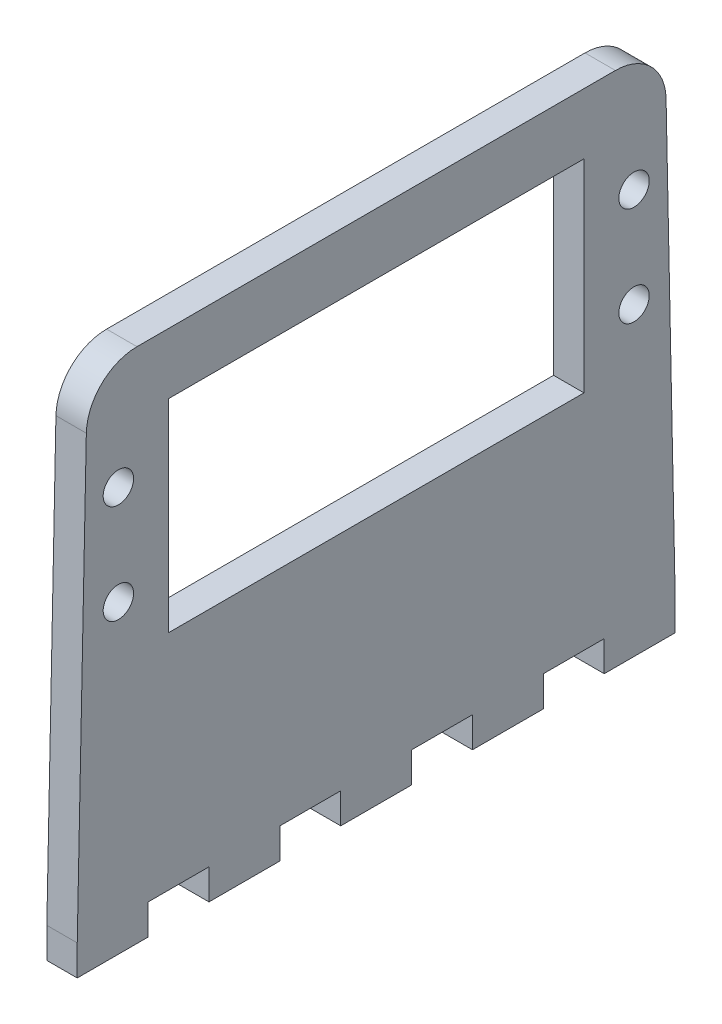
ISO-10303-21;
HEADER;
FILE_DESCRIPTION(('STEP AP214'),'2;1');
FILE_NAME('part.step','',(''),(''),'','','');
FILE_SCHEMA(('AUTOMOTIVE_DESIGN { 1 0 10303 214 1 1 1 1 }'));
ENDSEC;
DATA;
#1=APPLICATION_CONTEXT('core data for automotive mechanical design processes');
#2=APPLICATION_PROTOCOL_DEFINITION('international standard','automotive_design',2000,#1);
#3=PRODUCT_CONTEXT('',#1,'mechanical');
#4=PRODUCT('Part','Part','',(#3));
#5=PRODUCT_RELATED_PRODUCT_CATEGORY('part','',(#4));
#6=PRODUCT_DEFINITION_FORMATION('','',#4);
#7=PRODUCT_DEFINITION_CONTEXT('part definition',#1,'design');
#8=PRODUCT_DEFINITION('design','',#6,#7);
#9=PRODUCT_DEFINITION_SHAPE('','',#8);
#10=(LENGTH_UNIT() NAMED_UNIT(*) SI_UNIT(.MILLI.,.METRE.));
#11=(NAMED_UNIT(*) PLANE_ANGLE_UNIT() SI_UNIT($,.RADIAN.));
#12=(NAMED_UNIT(*) SI_UNIT($,.STERADIAN.) SOLID_ANGLE_UNIT());
#13=UNCERTAINTY_MEASURE_WITH_UNIT(LENGTH_MEASURE(1.E-05),#10,'distance_accuracy_value','');
#14=(GEOMETRIC_REPRESENTATION_CONTEXT(3) GLOBAL_UNCERTAINTY_ASSIGNED_CONTEXT((#13)) GLOBAL_UNIT_ASSIGNED_CONTEXT((#10,
#11,#12)) REPRESENTATION_CONTEXT('',''));
#15=CARTESIAN_POINT('',(0.,0.,0.));
#16=DIRECTION('',(0.,0.,1.));
#17=DIRECTION('',(1.,0.,0.));
#18=AXIS2_PLACEMENT_3D('',#15,#16,#17);
#19=CARTESIAN_POINT('',(3.,0.,0.));
#20=DIRECTION('',(-1.,0.,0.));
#21=DIRECTION('',(0.,0.,1.));
#22=AXIS2_PLACEMENT_3D('',#19,#20,#21);
#23=PLANE('',#22);
#24=DIRECTION('',(0.,0.,1.));
#25=VECTOR('',#24,1.);
#26=CARTESIAN_POINT('',(3.,48.,32.));
#27=LINE('',#26,#25);
#28=CARTESIAN_POINT('',(3.,48.,-20.1030817149342));
#29=VERTEX_POINT('',#28);
#30=CARTESIAN_POINT('',(3.,48.,27.1030817149343));
#31=VERTEX_POINT('',#30);
#32=EDGE_CURVE('E309',#29,#31,#27,.T.);
#33=ORIENTED_EDGE('',*,*,#32,.T.);
#34=CARTESIAN_POINT('',(3.,43.,27.1030817149343));
#35=DIRECTION('',(-1.,0.,0.));
#36=DIRECTION('',(0.,0.,1.));
#37=AXIS2_PLACEMENT_3D('',#34,#35,#36);
#38=CIRCLE('',#37,5.);
#39=CARTESIAN_POINT('',(3.,43.1041440684092,32.1019969985749));
#40=VERTEX_POINT('',#39);
#41=EDGE_CURVE('E43',#31,#40,#38,.F.);
#42=ORIENTED_EDGE('',*,*,#41,.T.);
#43=DIRECTION('',(0.,-0.999783056728112,0.0208288136818379));
#44=VECTOR('',#43,1.);
#45=CARTESIAN_POINT('',(3.,0.,33.0000000000002));
#46=LINE('',#45,#44);
#47=CARTESIAN_POINT('',(3.,0.,33.0000000000002));
#48=VERTEX_POINT('',#47);
#49=EDGE_CURVE('E311',#40,#48,#46,.T.);
#50=ORIENTED_EDGE('',*,*,#49,.T.);
#51=DIRECTION('',(0.,-1.,0.));
#52=VECTOR('',#51,1.);
#53=CARTESIAN_POINT('',(3.,-3.,33.0000000000002));
#54=LINE('',#53,#52);
#55=CARTESIAN_POINT('',(3.,-3.,33.0000000000002));
#56=VERTEX_POINT('',#55);
#57=EDGE_CURVE('E267',#48,#56,#54,.T.);
#58=ORIENTED_EDGE('',*,*,#57,.T.);
#59=DIRECTION('',(0.,0.,-1.));
#60=VECTOR('',#59,1.);
#61=CARTESIAN_POINT('',(3.,-3.,26.0000000000001));
#62=LINE('',#61,#60);
#63=CARTESIAN_POINT('',(3.,-3.,26.0000000000001));
#64=VERTEX_POINT('',#63);
#65=EDGE_CURVE('E270',#56,#64,#62,.T.);
#66=ORIENTED_EDGE('',*,*,#65,.T.);
#67=DIRECTION('',(0.,1.,0.));
#68=VECTOR('',#67,1.);
#69=CARTESIAN_POINT('',(3.,0.,26.0000000000001));
#70=LINE('',#69,#68);
#71=CARTESIAN_POINT('',(3.,0.,26.0000000000001));
#72=VERTEX_POINT('',#71);
#73=EDGE_CURVE('E273',#64,#72,#70,.T.);
#74=ORIENTED_EDGE('',*,*,#73,.T.);
#75=DIRECTION('',(0.,0.,-1.));
#76=VECTOR('',#75,1.);
#77=CARTESIAN_POINT('',(3.,0.,20.0000000000001));
#78=LINE('',#77,#76);
#79=CARTESIAN_POINT('',(3.,0.,20.0000000000001));
#80=VERTEX_POINT('',#79);
#81=EDGE_CURVE('E275',#72,#80,#78,.T.);
#82=ORIENTED_EDGE('',*,*,#81,.T.);
#83=DIRECTION('',(0.,-1.,0.));
#84=VECTOR('',#83,1.);
#85=CARTESIAN_POINT('',(3.,-3.,20.0000000000001));
#86=LINE('',#85,#84);
#87=CARTESIAN_POINT('',(3.,-3.,20.0000000000001));
#88=VERTEX_POINT('',#87);
#89=EDGE_CURVE('E277',#80,#88,#86,.T.);
#90=ORIENTED_EDGE('',*,*,#89,.T.);
#91=DIRECTION('',(0.,0.,-1.));
#92=VECTOR('',#91,1.);
#93=CARTESIAN_POINT('',(3.,-3.,13.0000000000001));
#94=LINE('',#93,#92);
#95=CARTESIAN_POINT('',(3.,-3.,13.0000000000001));
#96=VERTEX_POINT('',#95);
#97=EDGE_CURVE('E279',#88,#96,#94,.T.);
#98=ORIENTED_EDGE('',*,*,#97,.T.);
#99=DIRECTION('',(0.,1.,0.));
#100=VECTOR('',#99,1.);
#101=CARTESIAN_POINT('',(3.,0.,13.0000000000001));
#102=LINE('',#101,#100);
#103=CARTESIAN_POINT('',(3.,0.,13.0000000000001));
#104=VERTEX_POINT('',#103);
#105=EDGE_CURVE('E281',#96,#104,#102,.T.);
#106=ORIENTED_EDGE('',*,*,#105,.T.);
#107=DIRECTION('',(0.,0.,-1.));
#108=VECTOR('',#107,1.);
#109=CARTESIAN_POINT('',(3.,0.,7.00000000000008));
#110=LINE('',#109,#108);
#111=CARTESIAN_POINT('',(3.,0.,7.00000000000008));
#112=VERTEX_POINT('',#111);
#113=EDGE_CURVE('E283',#104,#112,#110,.T.);
#114=ORIENTED_EDGE('',*,*,#113,.T.);
#115=DIRECTION('',(0.,-1.,0.));
#116=VECTOR('',#115,1.);
#117=CARTESIAN_POINT('',(3.,-3.,7.00000000000006));
#118=LINE('',#117,#116);
#119=CARTESIAN_POINT('',(3.,-3.,7.00000000000006));
#120=VERTEX_POINT('',#119);
#121=EDGE_CURVE('E285',#112,#120,#118,.T.);
#122=ORIENTED_EDGE('',*,*,#121,.T.);
#123=DIRECTION('',(0.,0.,-1.));
#124=VECTOR('',#123,1.);
#125=CARTESIAN_POINT('',(3.,-3.,0.));
#126=LINE('',#125,#124);
#127=CARTESIAN_POINT('',(3.,-3.,0.));
#128=VERTEX_POINT('',#127);
#129=EDGE_CURVE('E287',#120,#128,#126,.T.);
#130=ORIENTED_EDGE('',*,*,#129,.T.);
#131=DIRECTION('',(0.,1.,0.));
#132=VECTOR('',#131,1.);
#133=CARTESIAN_POINT('',(3.,0.,0.));
#134=LINE('',#133,#132);
#135=CARTESIAN_POINT('',(3.,0.,0.));
#136=VERTEX_POINT('',#135);
#137=EDGE_CURVE('E289',#128,#136,#134,.T.);
#138=ORIENTED_EDGE('',*,*,#137,.T.);
#139=DIRECTION('',(0.,0.,-1.));
#140=VECTOR('',#139,1.);
#141=CARTESIAN_POINT('',(3.,0.,-6.00000000000001));
#142=LINE('',#141,#140);
#143=CARTESIAN_POINT('',(3.,0.,-6.00000000000001));
#144=VERTEX_POINT('',#143);
#145=EDGE_CURVE('E291',#136,#144,#142,.T.);
#146=ORIENTED_EDGE('',*,*,#145,.T.);
#147=DIRECTION('',(0.,-1.,0.));
#148=VECTOR('',#147,1.);
#149=CARTESIAN_POINT('',(3.,-3.,-6.00000000000001));
#150=LINE('',#149,#148);
#151=CARTESIAN_POINT('',(3.,-3.,-6.00000000000001));
#152=VERTEX_POINT('',#151);
#153=EDGE_CURVE('E293',#144,#152,#150,.T.);
#154=ORIENTED_EDGE('',*,*,#153,.T.);
#155=DIRECTION('',(0.,0.,-1.));
#156=VECTOR('',#155,1.);
#157=CARTESIAN_POINT('',(3.,-3.,-13.));
#158=LINE('',#157,#156);
#159=CARTESIAN_POINT('',(3.,-3.,-13.));
#160=VERTEX_POINT('',#159);
#161=EDGE_CURVE('E295',#152,#160,#158,.T.);
#162=ORIENTED_EDGE('',*,*,#161,.T.);
#163=DIRECTION('',(0.,1.,0.));
#164=VECTOR('',#163,1.);
#165=CARTESIAN_POINT('',(3.,0.,-13.));
#166=LINE('',#165,#164);
#167=CARTESIAN_POINT('',(3.,0.,-13.));
#168=VERTEX_POINT('',#167);
#169=EDGE_CURVE('E297',#160,#168,#166,.T.);
#170=ORIENTED_EDGE('',*,*,#169,.T.);
#171=DIRECTION('',(0.,0.,-1.));
#172=VECTOR('',#171,1.);
#173=CARTESIAN_POINT('',(3.,0.,-19.));
#174=LINE('',#173,#172);
#175=CARTESIAN_POINT('',(3.,0.,-19.));
#176=VERTEX_POINT('',#175);
#177=EDGE_CURVE('E299',#168,#176,#174,.T.);
#178=ORIENTED_EDGE('',*,*,#177,.T.);
#179=DIRECTION('',(0.,-1.,0.));
#180=VECTOR('',#179,1.);
#181=CARTESIAN_POINT('',(3.,-3.,-19.0000000000001));
#182=LINE('',#181,#180);
#183=CARTESIAN_POINT('',(3.,-3.,-19.0000000000001));
#184=VERTEX_POINT('',#183);
#185=EDGE_CURVE('E301',#176,#184,#182,.T.);
#186=ORIENTED_EDGE('',*,*,#185,.T.);
#187=DIRECTION('',(0.,0.,-1.));
#188=VECTOR('',#187,1.);
#189=CARTESIAN_POINT('',(3.,-3.,-26.0000000000001));
#190=LINE('',#189,#188);
#191=CARTESIAN_POINT('',(3.,-3.,-26.0000000000001));
#192=VERTEX_POINT('',#191);
#193=EDGE_CURVE('E303',#184,#192,#190,.T.);
#194=ORIENTED_EDGE('',*,*,#193,.T.);
#195=DIRECTION('',(0.,1.,0.));
#196=VECTOR('',#195,1.);
#197=CARTESIAN_POINT('',(3.,0.,-26.0000000000001));
#198=LINE('',#197,#196);
#199=CARTESIAN_POINT('',(3.,0.,-26.0000000000001));
#200=VERTEX_POINT('',#199);
#201=EDGE_CURVE('E305',#192,#200,#198,.T.);
#202=ORIENTED_EDGE('',*,*,#201,.T.);
#203=DIRECTION('',(0.,0.999783056728112,0.0208288136818379));
#204=VECTOR('',#203,1.);
#205=CARTESIAN_POINT('',(3.,48.,-25.));
#206=LINE('',#205,#204);
#207=CARTESIAN_POINT('',(3.,43.1041440684092,-25.1019969985748));
#208=VERTEX_POINT('',#207);
#209=EDGE_CURVE('E307',#200,#208,#206,.T.);
#210=ORIENTED_EDGE('',*,*,#209,.T.);
#211=CARTESIAN_POINT('',(3.,43.,-20.1030817149342));
#212=DIRECTION('',(-1.,0.,0.));
#213=DIRECTION('',(0.,0.,1.));
#214=AXIS2_PLACEMENT_3D('',#211,#212,#213);
#215=CIRCLE('',#214,5.);
#216=EDGE_CURVE('E427',#208,#29,#215,.F.);
#217=ORIENTED_EDGE('',*,*,#216,.T.);
#218=EDGE_LOOP('',(#33,#42,#50,#58,#66,#74,#82,#90,#98,#106,#114,#122,#130,#138,#146,#154,#162,
#170,#178,#186,#194,#202,#210,#217));
#219=FACE_BOUND('',#218,.T.);
#220=DIRECTION('',(0.,1.,0.));
#221=VECTOR('',#220,1.);
#222=CARTESIAN_POINT('',(3.,42.,-17.));
#223=LINE('',#222,#221);
#224=CARTESIAN_POINT('',(3.,22.,-17.));
#225=VERTEX_POINT('',#224);
#226=CARTESIAN_POINT('',(3.,42.,-17.));
#227=VERTEX_POINT('',#226);
#228=EDGE_CURVE('E223',#225,#227,#223,.T.);
#229=ORIENTED_EDGE('',*,*,#228,.F.);
#230=DIRECTION('',(0.,0.,-1.));
#231=VECTOR('',#230,1.);
#232=CARTESIAN_POINT('',(3.,22.,24.));
#233=LINE('',#232,#231);
#234=CARTESIAN_POINT('',(3.,22.,24.));
#235=VERTEX_POINT('',#234);
#236=EDGE_CURVE('E249',#235,#225,#233,.T.);
#237=ORIENTED_EDGE('',*,*,#236,.F.);
#238=DIRECTION('',(0.,-1.,0.));
#239=VECTOR('',#238,1.);
#240=CARTESIAN_POINT('',(3.,42.,24.));
#241=LINE('',#240,#239);
#242=CARTESIAN_POINT('',(3.,42.,24.));
#243=VERTEX_POINT('',#242);
#244=EDGE_CURVE('E247',#243,#235,#241,.T.);
#245=ORIENTED_EDGE('',*,*,#244,.F.);
#246=DIRECTION('',(0.,0.,1.));
#247=VECTOR('',#246,1.);
#248=CARTESIAN_POINT('',(3.,42.,24.));
#249=LINE('',#248,#247);
#250=EDGE_CURVE('E233',#227,#243,#249,.T.);
#251=ORIENTED_EDGE('',*,*,#250,.F.);
#252=EDGE_LOOP('',(#229,#237,#245,#251));
#253=FACE_BOUND('',#252,.T.);
#254=CARTESIAN_POINT('',(3.,36.9,-21.94));
#255=DIRECTION('',(1.,0.,0.));
#256=DIRECTION('',(0.,0.,-1.));
#257=AXIS2_PLACEMENT_3D('',#254,#255,#256);
#258=CIRCLE('',#257,1.5);
#259=CARTESIAN_POINT('',(3.,36.9,-23.44));
#260=VERTEX_POINT('',#259);
#261=EDGE_CURVE('E256',#260,#260,#258,.T.);
#262=ORIENTED_EDGE('',*,*,#261,.F.);
#263=EDGE_LOOP('',(#262));
#264=FACE_BOUND('',#263,.T.);
#265=CARTESIAN_POINT('',(3.,27.1,-21.94));
#266=DIRECTION('',(1.,0.,0.));
#267=DIRECTION('',(0.,0.,1.));
#268=AXIS2_PLACEMENT_3D('',#265,#266,#267);
#269=CIRCLE('',#268,1.5);
#270=CARTESIAN_POINT('',(3.,27.1,-20.44));
#271=VERTEX_POINT('',#270);
#272=EDGE_CURVE('E842',#271,#271,#269,.T.);
#273=ORIENTED_EDGE('',*,*,#272,.F.);
#274=EDGE_LOOP('',(#273));
#275=FACE_BOUND('',#274,.T.);
#276=CARTESIAN_POINT('',(3.,36.9,28.94));
#277=DIRECTION('',(1.,0.,0.));
#278=DIRECTION('',(0.,0.,1.));
#279=AXIS2_PLACEMENT_3D('',#276,#277,#278);
#280=CIRCLE('',#279,1.5);
#281=CARTESIAN_POINT('',(3.,36.9,30.44));
#282=VERTEX_POINT('',#281);
#283=EDGE_CURVE('E836',#282,#282,#280,.T.);
#284=ORIENTED_EDGE('',*,*,#283,.F.);
#285=EDGE_LOOP('',(#284));
#286=FACE_BOUND('',#285,.T.);
#287=CARTESIAN_POINT('',(3.,27.1,28.94));
#288=DIRECTION('',(1.,0.,0.));
#289=DIRECTION('',(0.,0.,-1.));
#290=AXIS2_PLACEMENT_3D('',#287,#288,#289);
#291=CIRCLE('',#290,1.5);
#292=CARTESIAN_POINT('',(3.,27.1,27.44));
#293=VERTEX_POINT('',#292);
#294=EDGE_CURVE('E827',#293,#293,#291,.T.);
#295=ORIENTED_EDGE('',*,*,#294,.F.);
#296=EDGE_LOOP('',(#295));
#297=FACE_BOUND('',#296,.T.);
#298=ADVANCED_FACE('F35',(#219,#253,#264,#275,#286,#297),#23,.F.);
#299=CARTESIAN_POINT('',(0.,0.,0.));
#300=DIRECTION('',(-1.,0.,0.));
#301=DIRECTION('',(0.,0.,1.));
#302=AXIS2_PLACEMENT_3D('',#299,#300,#301);
#303=PLANE('',#302);
#304=CARTESIAN_POINT('',(0.,36.9,28.94));
#305=DIRECTION('',(1.,0.,0.));
#306=DIRECTION('',(0.,0.,1.));
#307=AXIS2_PLACEMENT_3D('',#304,#305,#306);
#308=CIRCLE('',#307,1.5);
#309=CARTESIAN_POINT('',(0.,36.9,30.44));
#310=VERTEX_POINT('',#309);
#311=EDGE_CURVE('E833',#310,#310,#308,.T.);
#312=ORIENTED_EDGE('',*,*,#311,.T.);
#313=EDGE_LOOP('',(#312));
#314=FACE_BOUND('',#313,.T.);
#315=CARTESIAN_POINT('',(0.,36.9,-21.94));
#316=DIRECTION('',(1.,0.,0.));
#317=DIRECTION('',(0.,0.,-1.));
#318=AXIS2_PLACEMENT_3D('',#315,#316,#317);
#319=CIRCLE('',#318,1.5);
#320=CARTESIAN_POINT('',(0.,36.9,-23.44));
#321=VERTEX_POINT('',#320);
#322=EDGE_CURVE('E845',#321,#321,#319,.T.);
#323=ORIENTED_EDGE('',*,*,#322,.T.);
#324=EDGE_LOOP('',(#323));
#325=FACE_BOUND('',#324,.T.);
#326=DIRECTION('',(0.,-0.999783056728112,0.0208288136818379));
#327=VECTOR('',#326,1.);
#328=CARTESIAN_POINT('',(0.,0.,33.0000000000002));
#329=LINE('',#328,#327);
#330=CARTESIAN_POINT('',(0.,43.1041440684092,32.1019969985749));
#331=VERTEX_POINT('',#330);
#332=CARTESIAN_POINT('',(0.,0.,33.0000000000002));
#333=VERTEX_POINT('',#332);
#334=EDGE_CURVE('E271',#331,#333,#329,.T.);
#335=ORIENTED_EDGE('',*,*,#334,.F.);
#336=CARTESIAN_POINT('',(0.,43.,27.1030817149343));
#337=DIRECTION('',(-1.,0.,0.));
#338=DIRECTION('',(0.,0.,1.));
#339=AXIS2_PLACEMENT_3D('',#336,#337,#338);
#340=CIRCLE('',#339,5.);
#341=CARTESIAN_POINT('',(0.,48.,27.1030817149343));
#342=VERTEX_POINT('',#341);
#343=EDGE_CURVE('E421',#331,#342,#340,.T.);
#344=ORIENTED_EDGE('',*,*,#343,.T.);
#345=DIRECTION('',(0.,0.,1.));
#346=VECTOR('',#345,1.);
#347=CARTESIAN_POINT('',(0.,48.,32.));
#348=LINE('',#347,#346);
#349=CARTESIAN_POINT('',(0.,48.,-20.1030817149342));
#350=VERTEX_POINT('',#349);
#351=EDGE_CURVE('E354',#350,#342,#348,.T.);
#352=ORIENTED_EDGE('',*,*,#351,.F.);
#353=CARTESIAN_POINT('',(0.,43.,-20.1030817149342));
#354=DIRECTION('',(-1.,0.,0.));
#355=DIRECTION('',(0.,0.,1.));
#356=AXIS2_PLACEMENT_3D('',#353,#354,#355);
#357=CIRCLE('',#356,5.);
#358=CARTESIAN_POINT('',(0.,43.1041440684092,-25.1019969985748));
#359=VERTEX_POINT('',#358);
#360=EDGE_CURVE('E419',#350,#359,#357,.T.);
#361=ORIENTED_EDGE('',*,*,#360,.T.);
#362=DIRECTION('',(0.,0.999783056728112,0.0208288136818379));
#363=VECTOR('',#362,1.);
#364=CARTESIAN_POINT('',(0.,48.,-25.));
#365=LINE('',#364,#363);
#366=CARTESIAN_POINT('',(0.,0.,-26.0000000000001));
#367=VERTEX_POINT('',#366);
#368=EDGE_CURVE('E352',#367,#359,#365,.T.);
#369=ORIENTED_EDGE('',*,*,#368,.F.);
#370=DIRECTION('',(0.,1.,0.));
#371=VECTOR('',#370,1.);
#372=CARTESIAN_POINT('',(0.,0.,-26.0000000000001));
#373=LINE('',#372,#371);
#374=CARTESIAN_POINT('',(0.,-3.,-26.0000000000001));
#375=VERTEX_POINT('',#374);
#376=EDGE_CURVE('E350',#375,#367,#373,.T.);
#377=ORIENTED_EDGE('',*,*,#376,.F.);
#378=DIRECTION('',(0.,0.,-1.));
#379=VECTOR('',#378,1.);
#380=CARTESIAN_POINT('',(0.,-3.,-26.0000000000001));
#381=LINE('',#380,#379);
#382=CARTESIAN_POINT('',(0.,-3.,-19.0000000000001));
#383=VERTEX_POINT('',#382);
#384=EDGE_CURVE('E348',#383,#375,#381,.T.);
#385=ORIENTED_EDGE('',*,*,#384,.F.);
#386=DIRECTION('',(0.,-1.,0.));
#387=VECTOR('',#386,1.);
#388=CARTESIAN_POINT('',(0.,-3.,-19.0000000000001));
#389=LINE('',#388,#387);
#390=CARTESIAN_POINT('',(0.,0.,-19.));
#391=VERTEX_POINT('',#390);
#392=EDGE_CURVE('E346',#391,#383,#389,.T.);
#393=ORIENTED_EDGE('',*,*,#392,.F.);
#394=DIRECTION('',(0.,0.,-1.));
#395=VECTOR('',#394,1.);
#396=CARTESIAN_POINT('',(0.,0.,-19.));
#397=LINE('',#396,#395);
#398=CARTESIAN_POINT('',(0.,0.,-13.));
#399=VERTEX_POINT('',#398);
#400=EDGE_CURVE('E344',#399,#391,#397,.T.);
#401=ORIENTED_EDGE('',*,*,#400,.F.);
#402=DIRECTION('',(0.,1.,0.));
#403=VECTOR('',#402,1.);
#404=CARTESIAN_POINT('',(0.,0.,-13.));
#405=LINE('',#404,#403);
#406=CARTESIAN_POINT('',(0.,-3.,-13.));
#407=VERTEX_POINT('',#406);
#408=EDGE_CURVE('E342',#407,#399,#405,.T.);
#409=ORIENTED_EDGE('',*,*,#408,.F.);
#410=DIRECTION('',(0.,0.,-1.));
#411=VECTOR('',#410,1.);
#412=CARTESIAN_POINT('',(0.,-3.,-13.));
#413=LINE('',#412,#411);
#414=CARTESIAN_POINT('',(0.,-3.,-6.00000000000001));
#415=VERTEX_POINT('',#414);
#416=EDGE_CURVE('E340',#415,#407,#413,.T.);
#417=ORIENTED_EDGE('',*,*,#416,.F.);
#418=DIRECTION('',(0.,-1.,0.));
#419=VECTOR('',#418,1.);
#420=CARTESIAN_POINT('',(0.,-3.,-6.00000000000001));
#421=LINE('',#420,#419);
#422=CARTESIAN_POINT('',(0.,0.,-6.00000000000001));
#423=VERTEX_POINT('',#422);
#424=EDGE_CURVE('E338',#423,#415,#421,.T.);
#425=ORIENTED_EDGE('',*,*,#424,.F.);
#426=DIRECTION('',(0.,0.,-1.));
#427=VECTOR('',#426,1.);
#428=CARTESIAN_POINT('',(0.,0.,-6.00000000000001));
#429=LINE('',#428,#427);
#430=CARTESIAN_POINT('',(0.,0.,0.));
#431=VERTEX_POINT('',#430);
#432=EDGE_CURVE('E336',#431,#423,#429,.T.);
#433=ORIENTED_EDGE('',*,*,#432,.F.);
#434=DIRECTION('',(0.,1.,0.));
#435=VECTOR('',#434,1.);
#436=CARTESIAN_POINT('',(0.,0.,0.));
#437=LINE('',#436,#435);
#438=CARTESIAN_POINT('',(0.,-3.,0.));
#439=VERTEX_POINT('',#438);
#440=EDGE_CURVE('E334',#439,#431,#437,.T.);
#441=ORIENTED_EDGE('',*,*,#440,.F.);
#442=DIRECTION('',(0.,0.,-1.));
#443=VECTOR('',#442,1.);
#444=CARTESIAN_POINT('',(0.,-3.,0.));
#445=LINE('',#444,#443);
#446=CARTESIAN_POINT('',(0.,-3.,7.00000000000006));
#447=VERTEX_POINT('',#446);
#448=EDGE_CURVE('E332',#447,#439,#445,.T.);
#449=ORIENTED_EDGE('',*,*,#448,.F.);
#450=DIRECTION('',(0.,-1.,0.));
#451=VECTOR('',#450,1.);
#452=CARTESIAN_POINT('',(0.,-3.,7.00000000000006));
#453=LINE('',#452,#451);
#454=CARTESIAN_POINT('',(0.,0.,7.00000000000008));
#455=VERTEX_POINT('',#454);
#456=EDGE_CURVE('E330',#455,#447,#453,.T.);
#457=ORIENTED_EDGE('',*,*,#456,.F.);
#458=DIRECTION('',(0.,0.,-1.));
#459=VECTOR('',#458,1.);
#460=CARTESIAN_POINT('',(0.,0.,7.00000000000008));
#461=LINE('',#460,#459);
#462=CARTESIAN_POINT('',(0.,0.,13.0000000000001));
#463=VERTEX_POINT('',#462);
#464=EDGE_CURVE('E328',#463,#455,#461,.T.);
#465=ORIENTED_EDGE('',*,*,#464,.F.);
#466=DIRECTION('',(0.,1.,0.));
#467=VECTOR('',#466,1.);
#468=CARTESIAN_POINT('',(0.,0.,13.0000000000001));
#469=LINE('',#468,#467);
#470=CARTESIAN_POINT('',(0.,-3.,13.0000000000001));
#471=VERTEX_POINT('',#470);
#472=EDGE_CURVE('E326',#471,#463,#469,.T.);
#473=ORIENTED_EDGE('',*,*,#472,.F.);
#474=DIRECTION('',(0.,0.,-1.));
#475=VECTOR('',#474,1.);
#476=CARTESIAN_POINT('',(0.,-3.,13.0000000000001));
#477=LINE('',#476,#475);
#478=CARTESIAN_POINT('',(0.,-3.,20.0000000000001));
#479=VERTEX_POINT('',#478);
#480=EDGE_CURVE('E324',#479,#471,#477,.T.);
#481=ORIENTED_EDGE('',*,*,#480,.F.);
#482=DIRECTION('',(0.,-1.,0.));
#483=VECTOR('',#482,1.);
#484=CARTESIAN_POINT('',(0.,-3.,20.0000000000001));
#485=LINE('',#484,#483);
#486=CARTESIAN_POINT('',(0.,0.,20.0000000000001));
#487=VERTEX_POINT('',#486);
#488=EDGE_CURVE('E322',#487,#479,#485,.T.);
#489=ORIENTED_EDGE('',*,*,#488,.F.);
#490=DIRECTION('',(0.,0.,-1.));
#491=VECTOR('',#490,1.);
#492=CARTESIAN_POINT('',(0.,0.,20.0000000000001));
#493=LINE('',#492,#491);
#494=CARTESIAN_POINT('',(0.,0.,26.0000000000001));
#495=VERTEX_POINT('',#494);
#496=EDGE_CURVE('E320',#495,#487,#493,.T.);
#497=ORIENTED_EDGE('',*,*,#496,.F.);
#498=DIRECTION('',(0.,1.,0.));
#499=VECTOR('',#498,1.);
#500=CARTESIAN_POINT('',(0.,0.,26.0000000000001));
#501=LINE('',#500,#499);
#502=CARTESIAN_POINT('',(0.,-3.,26.0000000000001));
#503=VERTEX_POINT('',#502);
#504=EDGE_CURVE('E318',#503,#495,#501,.T.);
#505=ORIENTED_EDGE('',*,*,#504,.F.);
#506=DIRECTION('',(0.,0.,-1.));
#507=VECTOR('',#506,1.);
#508=CARTESIAN_POINT('',(0.,-3.,26.0000000000001));
#509=LINE('',#508,#507);
#510=CARTESIAN_POINT('',(0.,-3.,33.0000000000002));
#511=VERTEX_POINT('',#510);
#512=EDGE_CURVE('E316',#511,#503,#509,.T.);
#513=ORIENTED_EDGE('',*,*,#512,.F.);
#514=DIRECTION('',(0.,-1.,0.));
#515=VECTOR('',#514,1.);
#516=CARTESIAN_POINT('',(0.,-3.,33.0000000000002));
#517=LINE('',#516,#515);
#518=EDGE_CURVE('E241',#333,#511,#517,.T.);
#519=ORIENTED_EDGE('',*,*,#518,.F.);
#520=EDGE_LOOP('',(#335,#344,#352,#361,#369,#377,#385,#393,#401,#409,#417,#425,#433,#441,#449,
#457,#465,#473,#481,#489,#497,#505,#513,#519));
#521=FACE_BOUND('',#520,.T.);
#522=DIRECTION('',(0.,0.,-1.));
#523=VECTOR('',#522,1.);
#524=CARTESIAN_POINT('',(0.,22.,24.));
#525=LINE('',#524,#523);
#526=CARTESIAN_POINT('',(0.,22.,24.));
#527=VERTEX_POINT('',#526);
#528=CARTESIAN_POINT('',(0.,22.,-17.));
#529=VERTEX_POINT('',#528);
#530=EDGE_CURVE('E234',#527,#529,#525,.T.);
#531=ORIENTED_EDGE('',*,*,#530,.T.);
#532=DIRECTION('',(0.,1.,0.));
#533=VECTOR('',#532,1.);
#534=CARTESIAN_POINT('',(0.,42.,-17.));
#535=LINE('',#534,#533);
#536=CARTESIAN_POINT('',(0.,42.,-17.));
#537=VERTEX_POINT('',#536);
#538=EDGE_CURVE('E254',#529,#537,#535,.T.);
#539=ORIENTED_EDGE('',*,*,#538,.T.);
#540=DIRECTION('',(0.,0.,1.));
#541=VECTOR('',#540,1.);
#542=CARTESIAN_POINT('',(0.,42.,24.));
#543=LINE('',#542,#541);
#544=CARTESIAN_POINT('',(0.,42.,24.));
#545=VERTEX_POINT('',#544);
#546=EDGE_CURVE('E240',#537,#545,#543,.T.);
#547=ORIENTED_EDGE('',*,*,#546,.T.);
#548=DIRECTION('',(0.,-1.,0.));
#549=VECTOR('',#548,1.);
#550=CARTESIAN_POINT('',(0.,42.,24.));
#551=LINE('',#550,#549);
#552=EDGE_CURVE('E258',#545,#527,#551,.T.);
#553=ORIENTED_EDGE('',*,*,#552,.T.);
#554=EDGE_LOOP('',(#531,#539,#547,#553));
#555=FACE_BOUND('',#554,.T.);
#556=CARTESIAN_POINT('',(0.,27.1,-21.94));
#557=DIRECTION('',(1.,0.,0.));
#558=DIRECTION('',(0.,0.,1.));
#559=AXIS2_PLACEMENT_3D('',#556,#557,#558);
#560=CIRCLE('',#559,1.5);
#561=CARTESIAN_POINT('',(0.,27.1,-20.44));
#562=VERTEX_POINT('',#561);
#563=EDGE_CURVE('E839',#562,#562,#560,.T.);
#564=ORIENTED_EDGE('',*,*,#563,.T.);
#565=EDGE_LOOP('',(#564));
#566=FACE_BOUND('',#565,.T.);
#567=CARTESIAN_POINT('',(0.,27.1,28.94));
#568=DIRECTION('',(1.,0.,0.));
#569=DIRECTION('',(0.,0.,-1.));
#570=AXIS2_PLACEMENT_3D('',#567,#568,#569);
#571=CIRCLE('',#570,1.5);
#572=CARTESIAN_POINT('',(0.,27.1,27.44));
#573=VERTEX_POINT('',#572);
#574=EDGE_CURVE('E830',#573,#573,#571,.T.);
#575=ORIENTED_EDGE('',*,*,#574,.T.);
#576=EDGE_LOOP('',(#575));
#577=FACE_BOUND('',#576,.T.);
#578=ADVANCED_FACE('F441',(#314,#325,#521,#555,#566,#577),#303,.T.);
#579=CARTESIAN_POINT('',(3.,-3.,33.0000000000002));
#580=DIRECTION('',(0.,0.,-1.));
#581=DIRECTION('',(-1.,0.,0.));
#582=AXIS2_PLACEMENT_3D('',#579,#580,#581);
#583=PLANE('',#582);
#584=ORIENTED_EDGE('',*,*,#518,.T.);
#585=DIRECTION('',(-1.,0.,0.));
#586=VECTOR('',#585,1.);
#587=CARTESIAN_POINT('',(3.,-3.,33.0000000000002));
#588=LINE('',#587,#586);
#589=EDGE_CURVE('E413',#56,#511,#588,.T.);
#590=ORIENTED_EDGE('',*,*,#589,.F.);
#591=ORIENTED_EDGE('',*,*,#57,.F.);
#592=DIRECTION('',(-1.,0.,0.));
#593=VECTOR('',#592,1.);
#594=CARTESIAN_POINT('',(3.,0.,33.0000000000002));
#595=LINE('',#594,#593);
#596=EDGE_CURVE('E313',#48,#333,#595,.T.);
#597=ORIENTED_EDGE('',*,*,#596,.T.);
#598=EDGE_LOOP('',(#584,#590,#591,#597));
#599=FACE_BOUND('',#598,.T.);
#600=ADVANCED_FACE('F540',(#599),#583,.F.);
#601=CARTESIAN_POINT('',(3.,-3.,26.0000000000001));
#602=DIRECTION('',(0.,1.,0.));
#603=DIRECTION('',(0.,0.,1.));
#604=AXIS2_PLACEMENT_3D('',#601,#602,#603);
#605=PLANE('',#604);
#606=ORIENTED_EDGE('',*,*,#512,.T.);
#607=DIRECTION('',(-1.,0.,0.));
#608=VECTOR('',#607,1.);
#609=CARTESIAN_POINT('',(3.,-3.,26.0000000000001));
#610=LINE('',#609,#608);
#611=EDGE_CURVE('E410',#64,#503,#610,.T.);
#612=ORIENTED_EDGE('',*,*,#611,.F.);
#613=ORIENTED_EDGE('',*,*,#65,.F.);
#614=ORIENTED_EDGE('',*,*,#589,.T.);
#615=EDGE_LOOP('',(#606,#612,#613,#614));
#616=FACE_BOUND('',#615,.T.);
#617=ADVANCED_FACE('F537',(#616),#605,.F.);
#618=CARTESIAN_POINT('',(3.,0.,26.0000000000001));
#619=DIRECTION('',(0.,0.,1.));
#620=DIRECTION('',(1.,0.,0.));
#621=AXIS2_PLACEMENT_3D('',#618,#619,#620);
#622=PLANE('',#621);
#623=ORIENTED_EDGE('',*,*,#504,.T.);
#624=DIRECTION('',(-1.,0.,0.));
#625=VECTOR('',#624,1.);
#626=CARTESIAN_POINT('',(3.,0.,26.0000000000001));
#627=LINE('',#626,#625);
#628=EDGE_CURVE('E407',#72,#495,#627,.T.);
#629=ORIENTED_EDGE('',*,*,#628,.F.);
#630=ORIENTED_EDGE('',*,*,#73,.F.);
#631=ORIENTED_EDGE('',*,*,#611,.T.);
#632=EDGE_LOOP('',(#623,#629,#630,#631));
#633=FACE_BOUND('',#632,.T.);
#634=ADVANCED_FACE('F533',(#633),#622,.F.);
#635=CARTESIAN_POINT('',(3.,0.,20.0000000000001));
#636=DIRECTION('',(0.,1.,0.));
#637=DIRECTION('',(0.,0.,1.));
#638=AXIS2_PLACEMENT_3D('',#635,#636,#637);
#639=PLANE('',#638);
#640=ORIENTED_EDGE('',*,*,#496,.T.);
#641=DIRECTION('',(-1.,0.,0.));
#642=VECTOR('',#641,1.);
#643=CARTESIAN_POINT('',(3.,0.,20.0000000000001));
#644=LINE('',#643,#642);
#645=EDGE_CURVE('E404',#80,#487,#644,.T.);
#646=ORIENTED_EDGE('',*,*,#645,.F.);
#647=ORIENTED_EDGE('',*,*,#81,.F.);
#648=ORIENTED_EDGE('',*,*,#628,.T.);
#649=EDGE_LOOP('',(#640,#646,#647,#648));
#650=FACE_BOUND('',#649,.T.);
#651=ADVANCED_FACE('F529',(#650),#639,.F.);
#652=CARTESIAN_POINT('',(3.,-3.,20.0000000000001));
#653=DIRECTION('',(0.,0.,-1.));
#654=DIRECTION('',(0.,1.,0.));
#655=AXIS2_PLACEMENT_3D('',#652,#653,#654);
#656=PLANE('',#655);
#657=ORIENTED_EDGE('',*,*,#488,.T.);
#658=DIRECTION('',(-1.,0.,0.));
#659=VECTOR('',#658,1.);
#660=CARTESIAN_POINT('',(3.,-3.,20.0000000000001));
#661=LINE('',#660,#659);
#662=EDGE_CURVE('E401',#88,#479,#661,.T.);
#663=ORIENTED_EDGE('',*,*,#662,.F.);
#664=ORIENTED_EDGE('',*,*,#89,.F.);
#665=ORIENTED_EDGE('',*,*,#645,.T.);
#666=EDGE_LOOP('',(#657,#663,#664,#665));
#667=FACE_BOUND('',#666,.T.);
#668=ADVANCED_FACE('F525',(#667),#656,.F.);
#669=CARTESIAN_POINT('',(3.,-3.,13.0000000000001));
#670=DIRECTION('',(0.,1.,0.));
#671=DIRECTION('',(0.,0.,1.));
#672=AXIS2_PLACEMENT_3D('',#669,#670,#671);
#673=PLANE('',#672);
#674=ORIENTED_EDGE('',*,*,#480,.T.);
#675=DIRECTION('',(-1.,0.,0.));
#676=VECTOR('',#675,1.);
#677=CARTESIAN_POINT('',(3.,-3.,13.0000000000001));
#678=LINE('',#677,#676);
#679=EDGE_CURVE('E398',#96,#471,#678,.T.);
#680=ORIENTED_EDGE('',*,*,#679,.F.);
#681=ORIENTED_EDGE('',*,*,#97,.F.);
#682=ORIENTED_EDGE('',*,*,#662,.T.);
#683=EDGE_LOOP('',(#674,#680,#681,#682));
#684=FACE_BOUND('',#683,.T.);
#685=ADVANCED_FACE('F520',(#684),#673,.F.);
#686=CARTESIAN_POINT('',(3.,0.,13.0000000000001));
#687=DIRECTION('',(0.,0.,1.));
#688=DIRECTION('',(0.,-1.,0.));
#689=AXIS2_PLACEMENT_3D('',#686,#687,#688);
#690=PLANE('',#689);
#691=ORIENTED_EDGE('',*,*,#472,.T.);
#692=DIRECTION('',(-1.,0.,0.));
#693=VECTOR('',#692,1.);
#694=CARTESIAN_POINT('',(3.,0.,13.0000000000001));
#695=LINE('',#694,#693);
#696=EDGE_CURVE('E395',#104,#463,#695,.T.);
#697=ORIENTED_EDGE('',*,*,#696,.F.);
#698=ORIENTED_EDGE('',*,*,#105,.F.);
#699=ORIENTED_EDGE('',*,*,#679,.T.);
#700=EDGE_LOOP('',(#691,#697,#698,#699));
#701=FACE_BOUND('',#700,.T.);
#702=ADVANCED_FACE('F514',(#701),#690,.F.);
#703=CARTESIAN_POINT('',(3.,0.,7.00000000000008));
#704=DIRECTION('',(0.,1.,0.));
#705=DIRECTION('',(0.,0.,1.));
#706=AXIS2_PLACEMENT_3D('',#703,#704,#705);
#707=PLANE('',#706);
#708=ORIENTED_EDGE('',*,*,#464,.T.);
#709=DIRECTION('',(-1.,0.,0.));
#710=VECTOR('',#709,1.);
#711=CARTESIAN_POINT('',(3.,0.,7.00000000000008));
#712=LINE('',#711,#710);
#713=EDGE_CURVE('E392',#112,#455,#712,.T.);
#714=ORIENTED_EDGE('',*,*,#713,.F.);
#715=ORIENTED_EDGE('',*,*,#113,.F.);
#716=ORIENTED_EDGE('',*,*,#696,.T.);
#717=EDGE_LOOP('',(#708,#714,#715,#716));
#718=FACE_BOUND('',#717,.T.);
#719=ADVANCED_FACE('F510',(#718),#707,.F.);
#720=CARTESIAN_POINT('',(3.,-3.,7.00000000000006));
#721=DIRECTION('',(0.,0.,-1.));
#722=DIRECTION('',(0.,1.,0.));
#723=AXIS2_PLACEMENT_3D('',#720,#721,#722);
#724=PLANE('',#723);
#725=ORIENTED_EDGE('',*,*,#456,.T.);
#726=DIRECTION('',(-1.,0.,0.));
#727=VECTOR('',#726,1.);
#728=CARTESIAN_POINT('',(3.,-3.,7.00000000000006));
#729=LINE('',#728,#727);
#730=EDGE_CURVE('E389',#120,#447,#729,.T.);
#731=ORIENTED_EDGE('',*,*,#730,.F.);
#732=ORIENTED_EDGE('',*,*,#121,.F.);
#733=ORIENTED_EDGE('',*,*,#713,.T.);
#734=EDGE_LOOP('',(#725,#731,#732,#733));
#735=FACE_BOUND('',#734,.T.);
#736=ADVANCED_FACE('F505',(#735),#724,.F.);
#737=CARTESIAN_POINT('',(3.,-3.,0.));
#738=DIRECTION('',(0.,1.,0.));
#739=DIRECTION('',(0.,0.,1.));
#740=AXIS2_PLACEMENT_3D('',#737,#738,#739);
#741=PLANE('',#740);
#742=ORIENTED_EDGE('',*,*,#448,.T.);
#743=DIRECTION('',(-1.,0.,0.));
#744=VECTOR('',#743,1.);
#745=CARTESIAN_POINT('',(3.,-3.,0.));
#746=LINE('',#745,#744);
#747=EDGE_CURVE('E386',#128,#439,#746,.T.);
#748=ORIENTED_EDGE('',*,*,#747,.F.);
#749=ORIENTED_EDGE('',*,*,#129,.F.);
#750=ORIENTED_EDGE('',*,*,#730,.T.);
#751=EDGE_LOOP('',(#742,#748,#749,#750));
#752=FACE_BOUND('',#751,.T.);
#753=ADVANCED_FACE('F499',(#752),#741,.F.);
#754=CARTESIAN_POINT('',(3.,0.,0.));
#755=DIRECTION('',(0.,0.,1.));
#756=DIRECTION('',(0.,-1.,0.));
#757=AXIS2_PLACEMENT_3D('',#754,#755,#756);
#758=PLANE('',#757);
#759=ORIENTED_EDGE('',*,*,#440,.T.);
#760=DIRECTION('',(-1.,0.,0.));
#761=VECTOR('',#760,1.);
#762=CARTESIAN_POINT('',(3.,0.,0.));
#763=LINE('',#762,#761);
#764=EDGE_CURVE('E383',#136,#431,#763,.T.);
#765=ORIENTED_EDGE('',*,*,#764,.F.);
#766=ORIENTED_EDGE('',*,*,#137,.F.);
#767=ORIENTED_EDGE('',*,*,#747,.T.);
#768=EDGE_LOOP('',(#759,#765,#766,#767));
#769=FACE_BOUND('',#768,.T.);
#770=ADVANCED_FACE('F495',(#769),#758,.F.);
#771=CARTESIAN_POINT('',(3.,0.,-6.00000000000001));
#772=DIRECTION('',(0.,1.,0.));
#773=DIRECTION('',(0.,0.,1.));
#774=AXIS2_PLACEMENT_3D('',#771,#772,#773);
#775=PLANE('',#774);
#776=ORIENTED_EDGE('',*,*,#432,.T.);
#777=DIRECTION('',(-1.,0.,0.));
#778=VECTOR('',#777,1.);
#779=CARTESIAN_POINT('',(3.,0.,-6.00000000000001));
#780=LINE('',#779,#778);
#781=EDGE_CURVE('E380',#144,#423,#780,.T.);
#782=ORIENTED_EDGE('',*,*,#781,.F.);
#783=ORIENTED_EDGE('',*,*,#145,.F.);
#784=ORIENTED_EDGE('',*,*,#764,.T.);
#785=EDGE_LOOP('',(#776,#782,#783,#784));
#786=FACE_BOUND('',#785,.T.);
#787=ADVANCED_FACE('F490',(#786),#775,.F.);
#788=CARTESIAN_POINT('',(3.,-3.,-6.00000000000001));
#789=DIRECTION('',(0.,0.,-1.));
#790=DIRECTION('',(-1.,0.,0.));
#791=AXIS2_PLACEMENT_3D('',#788,#789,#790);
#792=PLANE('',#791);
#793=ORIENTED_EDGE('',*,*,#424,.T.);
#794=DIRECTION('',(-1.,0.,0.));
#795=VECTOR('',#794,1.);
#796=CARTESIAN_POINT('',(3.,-3.,-6.00000000000001));
#797=LINE('',#796,#795);
#798=EDGE_CURVE('E377',#152,#415,#797,.T.);
#799=ORIENTED_EDGE('',*,*,#798,.F.);
#800=ORIENTED_EDGE('',*,*,#153,.F.);
#801=ORIENTED_EDGE('',*,*,#781,.T.);
#802=EDGE_LOOP('',(#793,#799,#800,#801));
#803=FACE_BOUND('',#802,.T.);
#804=ADVANCED_FACE('F484',(#803),#792,.F.);
#805=CARTESIAN_POINT('',(3.,-3.,-13.));
#806=DIRECTION('',(0.,1.,0.));
#807=DIRECTION('',(0.,0.,1.));
#808=AXIS2_PLACEMENT_3D('',#805,#806,#807);
#809=PLANE('',#808);
#810=ORIENTED_EDGE('',*,*,#416,.T.);
#811=DIRECTION('',(-1.,0.,0.));
#812=VECTOR('',#811,1.);
#813=CARTESIAN_POINT('',(3.,-3.,-13.));
#814=LINE('',#813,#812);
#815=EDGE_CURVE('E374',#160,#407,#814,.T.);
#816=ORIENTED_EDGE('',*,*,#815,.F.);
#817=ORIENTED_EDGE('',*,*,#161,.F.);
#818=ORIENTED_EDGE('',*,*,#798,.T.);
#819=EDGE_LOOP('',(#810,#816,#817,#818));
#820=FACE_BOUND('',#819,.T.);
#821=ADVANCED_FACE('F480',(#820),#809,.F.);
#822=CARTESIAN_POINT('',(3.,0.,-13.));
#823=DIRECTION('',(0.,0.,1.));
#824=DIRECTION('',(0.,-1.,0.));
#825=AXIS2_PLACEMENT_3D('',#822,#823,#824);
#826=PLANE('',#825);
#827=ORIENTED_EDGE('',*,*,#408,.T.);
#828=DIRECTION('',(-1.,0.,0.));
#829=VECTOR('',#828,1.);
#830=CARTESIAN_POINT('',(3.,0.,-13.));
#831=LINE('',#830,#829);
#832=EDGE_CURVE('E371',#168,#399,#831,.T.);
#833=ORIENTED_EDGE('',*,*,#832,.F.);
#834=ORIENTED_EDGE('',*,*,#169,.F.);
#835=ORIENTED_EDGE('',*,*,#815,.T.);
#836=EDGE_LOOP('',(#827,#833,#834,#835));
#837=FACE_BOUND('',#836,.T.);
#838=ADVANCED_FACE('F475',(#837),#826,.F.);
#839=CARTESIAN_POINT('',(3.,0.,-19.));
#840=DIRECTION('',(0.,1.,0.));
#841=DIRECTION('',(0.,0.,1.));
#842=AXIS2_PLACEMENT_3D('',#839,#840,#841);
#843=PLANE('',#842);
#844=ORIENTED_EDGE('',*,*,#400,.T.);
#845=DIRECTION('',(-1.,0.,0.));
#846=VECTOR('',#845,1.);
#847=CARTESIAN_POINT('',(3.,0.,-19.));
#848=LINE('',#847,#846);
#849=EDGE_CURVE('E368',#176,#391,#848,.T.);
#850=ORIENTED_EDGE('',*,*,#849,.F.);
#851=ORIENTED_EDGE('',*,*,#177,.F.);
#852=ORIENTED_EDGE('',*,*,#832,.T.);
#853=EDGE_LOOP('',(#844,#850,#851,#852));
#854=FACE_BOUND('',#853,.T.);
#855=ADVANCED_FACE('F469',(#854),#843,.F.);
#856=CARTESIAN_POINT('',(3.,-3.,-19.0000000000001));
#857=DIRECTION('',(0.,0.,-1.));
#858=DIRECTION('',(0.,1.,0.));
#859=AXIS2_PLACEMENT_3D('',#856,#857,#858);
#860=PLANE('',#859);
#861=ORIENTED_EDGE('',*,*,#392,.T.);
#862=DIRECTION('',(-1.,0.,0.));
#863=VECTOR('',#862,1.);
#864=CARTESIAN_POINT('',(3.,-3.,-19.0000000000001));
#865=LINE('',#864,#863);
#866=EDGE_CURVE('E365',#184,#383,#865,.T.);
#867=ORIENTED_EDGE('',*,*,#866,.F.);
#868=ORIENTED_EDGE('',*,*,#185,.F.);
#869=ORIENTED_EDGE('',*,*,#849,.T.);
#870=EDGE_LOOP('',(#861,#867,#868,#869));
#871=FACE_BOUND('',#870,.T.);
#872=ADVANCED_FACE('F465',(#871),#860,.F.);
#873=CARTESIAN_POINT('',(3.,-3.,-26.0000000000001));
#874=DIRECTION('',(0.,1.,0.));
#875=DIRECTION('',(0.,0.,1.));
#876=AXIS2_PLACEMENT_3D('',#873,#874,#875);
#877=PLANE('',#876);
#878=ORIENTED_EDGE('',*,*,#384,.T.);
#879=DIRECTION('',(-1.,0.,0.));
#880=VECTOR('',#879,1.);
#881=CARTESIAN_POINT('',(3.,-3.,-26.0000000000001));
#882=LINE('',#881,#880);
#883=EDGE_CURVE('E362',#192,#375,#882,.T.);
#884=ORIENTED_EDGE('',*,*,#883,.F.);
#885=ORIENTED_EDGE('',*,*,#193,.F.);
#886=ORIENTED_EDGE('',*,*,#866,.T.);
#887=EDGE_LOOP('',(#878,#884,#885,#886));
#888=FACE_BOUND('',#887,.T.);
#889=ADVANCED_FACE('F460',(#888),#877,.F.);
#890=CARTESIAN_POINT('',(3.,0.,-26.0000000000001));
#891=DIRECTION('',(0.,0.,1.));
#892=DIRECTION('',(0.,-1.,0.));
#893=AXIS2_PLACEMENT_3D('',#890,#891,#892);
#894=PLANE('',#893);
#895=ORIENTED_EDGE('',*,*,#376,.T.);
#896=DIRECTION('',(-1.,0.,0.));
#897=VECTOR('',#896,1.);
#898=CARTESIAN_POINT('',(3.,0.,-26.0000000000001));
#899=LINE('',#898,#897);
#900=EDGE_CURVE('E359',#200,#367,#899,.T.);
#901=ORIENTED_EDGE('',*,*,#900,.F.);
#902=ORIENTED_EDGE('',*,*,#201,.F.);
#903=ORIENTED_EDGE('',*,*,#883,.T.);
#904=EDGE_LOOP('',(#895,#901,#902,#903));
#905=FACE_BOUND('',#904,.T.);
#906=ADVANCED_FACE('F454',(#905),#894,.F.);
#907=CARTESIAN_POINT('',(3.,48.,-25.));
#908=DIRECTION('',(0.,-0.0208288136818379,0.999783056728112));
#909=DIRECTION('',(0.,-0.999783056728112,-0.0208288136818379));
#910=AXIS2_PLACEMENT_3D('',#907,#908,#909);
#911=PLANE('',#910);
#912=ORIENTED_EDGE('',*,*,#368,.T.);
#913=DIRECTION('',(-1.,0.,0.));
#914=VECTOR('',#913,1.);
#915=CARTESIAN_POINT('',(3.,43.1041440684092,-25.1019969985748));
#916=LINE('',#915,#914);
#917=EDGE_CURVE('E11',#359,#208,#916,.F.);
#918=ORIENTED_EDGE('',*,*,#917,.T.);
#919=ORIENTED_EDGE('',*,*,#209,.F.);
#920=ORIENTED_EDGE('',*,*,#900,.T.);
#921=EDGE_LOOP('',(#912,#918,#919,#920));
#922=FACE_BOUND('',#921,.T.);
#923=ADVANCED_FACE('F450',(#922),#911,.F.);
#924=CARTESIAN_POINT('',(3.,48.,32.));
#925=DIRECTION('',(0.,-1.,0.));
#926=DIRECTION('',(0.,0.,-1.));
#927=AXIS2_PLACEMENT_3D('',#924,#925,#926);
#928=PLANE('',#927);
#929=ORIENTED_EDGE('',*,*,#351,.T.);
#930=DIRECTION('',(-1.,0.,0.));
#931=VECTOR('',#930,1.);
#932=CARTESIAN_POINT('',(3.,48.,27.1030817149343));
#933=LINE('',#932,#931);
#934=EDGE_CURVE('E56',#342,#31,#933,.F.);
#935=ORIENTED_EDGE('',*,*,#934,.T.);
#936=ORIENTED_EDGE('',*,*,#32,.F.);
#937=DIRECTION('',(-1.,0.,0.));
#938=VECTOR('',#937,1.);
#939=CARTESIAN_POINT('',(3.,48.,-20.1030817149342));
#940=LINE('',#939,#938);
#941=EDGE_CURVE('E423',#29,#350,#940,.T.);
#942=ORIENTED_EDGE('',*,*,#941,.T.);
#943=EDGE_LOOP('',(#929,#935,#936,#942));
#944=FACE_BOUND('',#943,.T.);
#945=ADVANCED_FACE('F444',(#944),#928,.F.);
#946=CARTESIAN_POINT('',(3.,0.,33.0000000000002));
#947=DIRECTION('',(0.,-0.0208288136818379,-0.999783056728112));
#948=DIRECTION('',(0.,0.999783056728112,-0.0208288136818379));
#949=AXIS2_PLACEMENT_3D('',#946,#947,#948);
#950=PLANE('',#949);
#951=ORIENTED_EDGE('',*,*,#49,.F.);
#952=DIRECTION('',(-1.,0.,0.));
#953=VECTOR('',#952,1.);
#954=CARTESIAN_POINT('',(3.,43.1041440684092,32.1019969985749));
#955=LINE('',#954,#953);
#956=EDGE_CURVE('E416',#40,#331,#955,.T.);
#957=ORIENTED_EDGE('',*,*,#956,.T.);
#958=ORIENTED_EDGE('',*,*,#334,.T.);
#959=ORIENTED_EDGE('',*,*,#596,.F.);
#960=EDGE_LOOP('',(#951,#957,#958,#959));
#961=FACE_BOUND('',#960,.T.);
#962=ADVANCED_FACE('F435',(#961),#950,.F.);
#963=CARTESIAN_POINT('',(3.,42.,-17.));
#964=DIRECTION('',(0.,0.,1.));
#965=DIRECTION('',(1.,0.,0.));
#966=AXIS2_PLACEMENT_3D('',#963,#964,#965);
#967=PLANE('',#966);
#968=ORIENTED_EDGE('',*,*,#538,.F.);
#969=DIRECTION('',(-1.,0.,0.));
#970=VECTOR('',#969,1.);
#971=CARTESIAN_POINT('',(3.,22.,-17.));
#972=LINE('',#971,#970);
#973=EDGE_CURVE('E229',#225,#529,#972,.T.);
#974=ORIENTED_EDGE('',*,*,#973,.F.);
#975=ORIENTED_EDGE('',*,*,#228,.T.);
#976=DIRECTION('',(-1.,0.,0.));
#977=VECTOR('',#976,1.);
#978=CARTESIAN_POINT('',(3.,42.,-17.));
#979=LINE('',#978,#977);
#980=EDGE_CURVE('E226',#227,#537,#979,.T.);
#981=ORIENTED_EDGE('',*,*,#980,.T.);
#982=EDGE_LOOP('',(#968,#974,#975,#981));
#983=FACE_BOUND('',#982,.T.);
#984=ADVANCED_FACE('F225',(#983),#967,.T.);
#985=CARTESIAN_POINT('',(3.,42.,24.));
#986=DIRECTION('',(0.,-1.,0.));
#987=DIRECTION('',(0.,0.,-1.));
#988=AXIS2_PLACEMENT_3D('',#985,#986,#987);
#989=PLANE('',#988);
#990=ORIENTED_EDGE('',*,*,#546,.F.);
#991=ORIENTED_EDGE('',*,*,#980,.F.);
#992=ORIENTED_EDGE('',*,*,#250,.T.);
#993=DIRECTION('',(-1.,0.,0.));
#994=VECTOR('',#993,1.);
#995=CARTESIAN_POINT('',(3.,42.,24.));
#996=LINE('',#995,#994);
#997=EDGE_CURVE('E242',#243,#545,#996,.T.);
#998=ORIENTED_EDGE('',*,*,#997,.T.);
#999=EDGE_LOOP('',(#990,#991,#992,#998));
#1000=FACE_BOUND('',#999,.T.);
#1001=ADVANCED_FACE('F237',(#1000),#989,.T.);
#1002=CARTESIAN_POINT('',(3.,42.,24.));
#1003=DIRECTION('',(0.,0.,-1.));
#1004=DIRECTION('',(-1.,0.,0.));
#1005=AXIS2_PLACEMENT_3D('',#1002,#1003,#1004);
#1006=PLANE('',#1005);
#1007=ORIENTED_EDGE('',*,*,#552,.F.);
#1008=ORIENTED_EDGE('',*,*,#997,.F.);
#1009=ORIENTED_EDGE('',*,*,#244,.T.);
#1010=DIRECTION('',(-1.,0.,0.));
#1011=VECTOR('',#1010,1.);
#1012=CARTESIAN_POINT('',(3.,22.,24.));
#1013=LINE('',#1012,#1011);
#1014=EDGE_CURVE('E264',#235,#527,#1013,.T.);
#1015=ORIENTED_EDGE('',*,*,#1014,.T.);
#1016=EDGE_LOOP('',(#1007,#1008,#1009,#1015));
#1017=FACE_BOUND('',#1016,.T.);
#1018=ADVANCED_FACE('F689',(#1017),#1006,.T.);
#1019=CARTESIAN_POINT('',(3.,22.,24.));
#1020=DIRECTION('',(0.,1.,0.));
#1021=DIRECTION('',(0.,0.,1.));
#1022=AXIS2_PLACEMENT_3D('',#1019,#1020,#1021);
#1023=PLANE('',#1022);
#1024=ORIENTED_EDGE('',*,*,#530,.F.);
#1025=ORIENTED_EDGE('',*,*,#1014,.F.);
#1026=ORIENTED_EDGE('',*,*,#236,.T.);
#1027=ORIENTED_EDGE('',*,*,#973,.T.);
#1028=EDGE_LOOP('',(#1024,#1025,#1026,#1027));
#1029=FACE_BOUND('',#1028,.T.);
#1030=ADVANCED_FACE('F695',(#1029),#1023,.T.);
#1031=CARTESIAN_POINT('',(3.,36.9,-21.94));
#1032=DIRECTION('',(-1.,0.,0.));
#1033=DIRECTION('',(0.,0.,1.));
#1034=AXIS2_PLACEMENT_3D('',#1031,#1032,#1033);
#1035=CYLINDRICAL_SURFACE('',#1034,1.5);
#1036=ORIENTED_EDGE('',*,*,#261,.T.);
#1037=EDGE_LOOP('',(#1036));
#1038=FACE_BOUND('',#1037,.T.);
#1039=ORIENTED_EDGE('',*,*,#322,.F.);
#1040=EDGE_LOOP('',(#1039));
#1041=FACE_BOUND('',#1040,.T.);
#1042=ADVANCED_FACE('F703',(#1038,#1041),#1035,.F.);
#1043=CARTESIAN_POINT('',(3.,27.1,-21.94));
#1044=DIRECTION('',(-1.,0.,0.));
#1045=DIRECTION('',(0.,0.,1.));
#1046=AXIS2_PLACEMENT_3D('',#1043,#1044,#1045);
#1047=CYLINDRICAL_SURFACE('',#1046,1.5);
#1048=ORIENTED_EDGE('',*,*,#272,.T.);
#1049=EDGE_LOOP('',(#1048));
#1050=FACE_BOUND('',#1049,.T.);
#1051=ORIENTED_EDGE('',*,*,#563,.F.);
#1052=EDGE_LOOP('',(#1051));
#1053=FACE_BOUND('',#1052,.T.);
#1054=ADVANCED_FACE('F711',(#1050,#1053),#1047,.F.);
#1055=CARTESIAN_POINT('',(3.,36.9,28.94));
#1056=DIRECTION('',(-1.,0.,0.));
#1057=DIRECTION('',(0.,0.,1.));
#1058=AXIS2_PLACEMENT_3D('',#1055,#1056,#1057);
#1059=CYLINDRICAL_SURFACE('',#1058,1.5);
#1060=ORIENTED_EDGE('',*,*,#283,.T.);
#1061=EDGE_LOOP('',(#1060));
#1062=FACE_BOUND('',#1061,.T.);
#1063=ORIENTED_EDGE('',*,*,#311,.F.);
#1064=EDGE_LOOP('',(#1063));
#1065=FACE_BOUND('',#1064,.T.);
#1066=ADVANCED_FACE('F719',(#1062,#1065),#1059,.F.);
#1067=CARTESIAN_POINT('',(3.,27.1,28.94));
#1068=DIRECTION('',(-1.,0.,0.));
#1069=DIRECTION('',(0.,0.,1.));
#1070=AXIS2_PLACEMENT_3D('',#1067,#1068,#1069);
#1071=CYLINDRICAL_SURFACE('',#1070,1.5);
#1072=ORIENTED_EDGE('',*,*,#294,.T.);
#1073=EDGE_LOOP('',(#1072));
#1074=FACE_BOUND('',#1073,.T.);
#1075=ORIENTED_EDGE('',*,*,#574,.F.);
#1076=EDGE_LOOP('',(#1075));
#1077=FACE_BOUND('',#1076,.T.);
#1078=ADVANCED_FACE('F727',(#1074,#1077),#1071,.F.);
#1079=CARTESIAN_POINT('',(3.,43.,27.1030817149343));
#1080=DIRECTION('',(-1.,0.,0.));
#1081=DIRECTION('',(0.,0.,1.));
#1082=AXIS2_PLACEMENT_3D('',#1079,#1080,#1081);
#1083=CYLINDRICAL_SURFACE('',#1082,5.);
#1084=ORIENTED_EDGE('',*,*,#41,.F.);
#1085=ORIENTED_EDGE('',*,*,#934,.F.);
#1086=ORIENTED_EDGE('',*,*,#343,.F.);
#1087=ORIENTED_EDGE('',*,*,#956,.F.);
#1088=EDGE_LOOP('',(#1084,#1085,#1086,#1087));
#1089=FACE_BOUND('',#1088,.T.);
#1090=ADVANCED_FACE('F438',(#1089),#1083,.T.);
#1091=CARTESIAN_POINT('',(3.,43.,-20.1030817149342));
#1092=DIRECTION('',(-1.,0.,0.));
#1093=DIRECTION('',(0.,0.,1.));
#1094=AXIS2_PLACEMENT_3D('',#1091,#1092,#1093);
#1095=CYLINDRICAL_SURFACE('',#1094,5.);
#1096=ORIENTED_EDGE('',*,*,#216,.F.);
#1097=ORIENTED_EDGE('',*,*,#917,.F.);
#1098=ORIENTED_EDGE('',*,*,#360,.F.);
#1099=ORIENTED_EDGE('',*,*,#941,.F.);
#1100=EDGE_LOOP('',(#1096,#1097,#1098,#1099));
#1101=FACE_BOUND('',#1100,.T.);
#1102=ADVANCED_FACE('F37',(#1101),#1095,.T.);
#1103=CLOSED_SHELL('',(#298,#578,#600,#617,#634,#651,#668,#685,#702,#719,#736,#753,#770,#787,
#804,#821,#838,#855,#872,#889,#906,#923,#945,#962,#984,#1001,#1018,#1030,#1042,#1054,#1066,
#1078,#1090,#1102));
#1104=MANIFOLD_SOLID_BREP('B2',#1103);
#1105=ADVANCED_BREP_SHAPE_REPRESENTATION('',(#18,#1104),#14);
#1106=SHAPE_DEFINITION_REPRESENTATION(#9,#1105);
ENDSEC;
END-ISO-10303-21;
